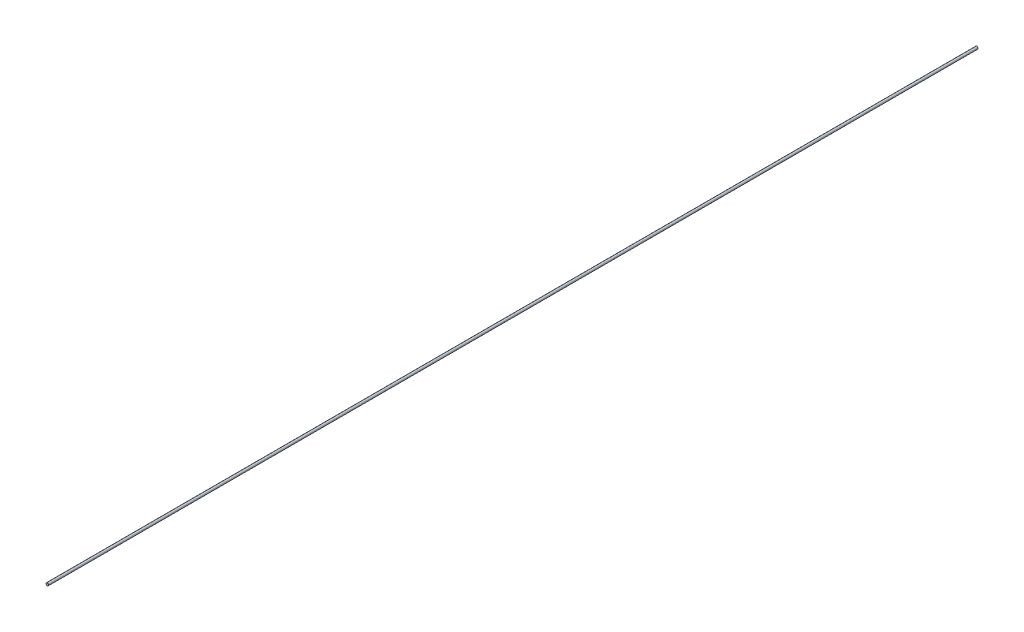
ISO-10303-21;
HEADER;
FILE_DESCRIPTION(('STEP AP214'),'2;1');
FILE_NAME('part.step','',(''),(''),'','','');
FILE_SCHEMA(('AUTOMOTIVE_DESIGN { 1 0 10303 214 1 1 1 1 }'));
ENDSEC;
DATA;
#1=APPLICATION_CONTEXT('core data for automotive mechanical design processes');
#2=APPLICATION_PROTOCOL_DEFINITION('international standard','automotive_design',2000,#1);
#3=PRODUCT_CONTEXT('',#1,'mechanical');
#4=PRODUCT('Part','Part','',(#3));
#5=PRODUCT_RELATED_PRODUCT_CATEGORY('part','',(#4));
#6=PRODUCT_DEFINITION_FORMATION('','',#4);
#7=PRODUCT_DEFINITION_CONTEXT('part definition',#1,'design');
#8=PRODUCT_DEFINITION('design','',#6,#7);
#9=PRODUCT_DEFINITION_SHAPE('','',#8);
#10=(LENGTH_UNIT() NAMED_UNIT(*) SI_UNIT(.MILLI.,.METRE.));
#11=(NAMED_UNIT(*) PLANE_ANGLE_UNIT() SI_UNIT($,.RADIAN.));
#12=(NAMED_UNIT(*) SI_UNIT($,.STERADIAN.) SOLID_ANGLE_UNIT());
#13=UNCERTAINTY_MEASURE_WITH_UNIT(LENGTH_MEASURE(1.E-05),#10,'distance_accuracy_value','');
#14=(GEOMETRIC_REPRESENTATION_CONTEXT(3) GLOBAL_UNCERTAINTY_ASSIGNED_CONTEXT((#13)) GLOBAL_UNIT_ASSIGNED_CONTEXT((#10,
#11,#12)) REPRESENTATION_CONTEXT('',''));
#15=CARTESIAN_POINT('',(0.,0.,0.));
#16=DIRECTION('',(0.,0.,1.));
#17=DIRECTION('',(1.,0.,0.));
#18=AXIS2_PLACEMENT_3D('',#15,#16,#17);
#19=CARTESIAN_POINT('',(0.,0.,914.4));
#20=DIRECTION('',(0.,0.,-1.));
#21=DIRECTION('',(-1.,0.,0.));
#22=AXIS2_PLACEMENT_3D('',#19,#20,#21);
#23=CYLINDRICAL_SURFACE('',#22,2.5);
#24=CARTESIAN_POINT('',(0.,0.,914.4));
#25=DIRECTION('',(0.,0.,1.));
#26=DIRECTION('',(1.,0.,0.));
#27=AXIS2_PLACEMENT_3D('',#24,#25,#26);
#28=CIRCLE('',#27,2.5);
#29=CARTESIAN_POINT('',(-2.5,0.,914.4));
#30=VERTEX_POINT('',#29);
#31=EDGE_CURVE('E10',#30,#30,#28,.T.);
#32=CARTESIAN_POINT('',(0.,0.,-914.4));
#33=DIRECTION('',(0.,0.,1.));
#34=DIRECTION('',(1.,0.,0.));
#35=AXIS2_PLACEMENT_3D('',#32,#33,#34);
#36=CIRCLE('',#35,2.5);
#37=CARTESIAN_POINT('',(-2.5,0.,-914.4));
#38=VERTEX_POINT('',#37);
#39=EDGE_CURVE('E38',#38,#38,#36,.T.);
#40=CARTESIAN_POINT('',(-2.5,0.,914.4));
#41=CARTESIAN_POINT('',(-2.5,0.,895.35));
#42=CARTESIAN_POINT('',(-2.5,0.,876.3));
#43=CARTESIAN_POINT('',(-2.5,0.,838.2));
#44=CARTESIAN_POINT('',(-2.5,0.,819.15));
#45=CARTESIAN_POINT('',(-2.5,0.,781.05));
#46=CARTESIAN_POINT('',(-2.5,0.,762.));
#47=CARTESIAN_POINT('',(-2.5,0.,723.9));
#48=CARTESIAN_POINT('',(-2.5,0.,704.85));
#49=CARTESIAN_POINT('',(-2.5,0.,666.75));
#50=CARTESIAN_POINT('',(-2.5,0.,647.7));
#51=CARTESIAN_POINT('',(-2.5,0.,609.6));
#52=CARTESIAN_POINT('',(-2.5,0.,590.55));
#53=CARTESIAN_POINT('',(-2.5,0.,552.45));
#54=CARTESIAN_POINT('',(-2.5,0.,533.4));
#55=CARTESIAN_POINT('',(-2.5,0.,495.3));
#56=CARTESIAN_POINT('',(-2.5,0.,476.25));
#57=CARTESIAN_POINT('',(-2.5,0.,438.15));
#58=CARTESIAN_POINT('',(-2.5,0.,419.1));
#59=CARTESIAN_POINT('',(-2.5,0.,381.));
#60=CARTESIAN_POINT('',(-2.5,0.,361.95));
#61=CARTESIAN_POINT('',(-2.5,0.,323.85));
#62=CARTESIAN_POINT('',(-2.5,0.,304.8));
#63=CARTESIAN_POINT('',(-2.5,0.,266.7));
#64=CARTESIAN_POINT('',(-2.5,0.,247.65));
#65=CARTESIAN_POINT('',(-2.5,0.,209.55));
#66=CARTESIAN_POINT('',(-2.5,0.,190.5));
#67=CARTESIAN_POINT('',(-2.5,0.,152.4));
#68=CARTESIAN_POINT('',(-2.5,0.,133.35));
#69=CARTESIAN_POINT('',(-2.5,0.,95.2499999999998));
#70=CARTESIAN_POINT('',(-2.5,0.,76.1999999999998));
#71=CARTESIAN_POINT('',(-2.5,0.,38.0999999999998));
#72=CARTESIAN_POINT('',(-2.5,0.,19.0499999999998));
#73=CARTESIAN_POINT('',(-2.5,0.,-19.0500000000002));
#74=CARTESIAN_POINT('',(-2.5,0.,-38.1000000000002));
#75=CARTESIAN_POINT('',(-2.5,0.,-76.2000000000002));
#76=CARTESIAN_POINT('',(-2.5,0.,-95.2500000000001));
#77=CARTESIAN_POINT('',(-2.5,0.,-133.35));
#78=CARTESIAN_POINT('',(-2.5,0.,-152.4));
#79=CARTESIAN_POINT('',(-2.5,0.,-190.5));
#80=CARTESIAN_POINT('',(-2.5,0.,-209.55));
#81=CARTESIAN_POINT('',(-2.5,0.,-247.65));
#82=CARTESIAN_POINT('',(-2.5,0.,-266.7));
#83=CARTESIAN_POINT('',(-2.5,0.,-304.8));
#84=CARTESIAN_POINT('',(-2.5,0.,-323.85));
#85=CARTESIAN_POINT('',(-2.5,0.,-361.95));
#86=CARTESIAN_POINT('',(-2.5,0.,-381.));
#87=CARTESIAN_POINT('',(-2.5,0.,-419.1));
#88=CARTESIAN_POINT('',(-2.5,0.,-438.15));
#89=CARTESIAN_POINT('',(-2.5,0.,-476.25));
#90=CARTESIAN_POINT('',(-2.5,0.,-495.3));
#91=CARTESIAN_POINT('',(-2.5,0.,-533.4));
#92=CARTESIAN_POINT('',(-2.5,0.,-552.45));
#93=CARTESIAN_POINT('',(-2.5,0.,-590.55));
#94=CARTESIAN_POINT('',(-2.5,0.,-609.6));
#95=CARTESIAN_POINT('',(-2.5,0.,-647.7));
#96=CARTESIAN_POINT('',(-2.5,0.,-666.75));
#97=CARTESIAN_POINT('',(-2.5,0.,-704.85));
#98=CARTESIAN_POINT('',(-2.5,0.,-723.9));
#99=CARTESIAN_POINT('',(-2.5,0.,-762.));
#100=CARTESIAN_POINT('',(-2.5,0.,-781.05));
#101=CARTESIAN_POINT('',(-2.5,0.,-819.15));
#102=CARTESIAN_POINT('',(-2.5,0.,-838.2));
#103=CARTESIAN_POINT('',(-2.5,0.,-876.3));
#104=CARTESIAN_POINT('',(-2.5,0.,-895.35));
#105=CARTESIAN_POINT('',(-2.5,0.,-914.4));
#106=B_SPLINE_CURVE_WITH_KNOTS('',3,(#40,#41,#42,#43,#44,#45,#46,#47,#48,#49,#50,#51,#52,#53,
#54,#55,#56,#57,#58,#59,#60,#61,#62,#63,#64,#65,#66,#67,#68,#69,#70,#71,#72,#73,#74,#75,#76,#77,
#78,#79,#80,#81,#82,#83,#84,#85,#86,#87,#88,#89,#90,#91,#92,#93,#94,#95,#96,#97,#98,#99,#100,
#101,#102,#103,#104,#105),.UNSPECIFIED.,.F.,.F.,(4,2,2,2,2,2,2,2,2,2,2,2,2,2,2,2,2,2,2,2,2,2,2,
2,2,2,2,2,2,2,2,2,4),(0.,57.1499999999999,114.3,171.45,228.6,285.75,342.9,400.05,457.2,514.35,
571.5,628.65,685.8,742.95,800.1,857.25,914.4,971.55,1028.7,1085.85,1143.,1200.15,1257.3,1314.45,
1371.6,1428.75,1485.9,1543.05,1600.2,1657.35,1714.5,1771.65,1828.8),.UNSPECIFIED.);
#107=EDGE_CURVE('BSEAM32',#30,#38,#106,.T.);
#108=ORIENTED_EDGE('',*,*,#31,.F.);
#109=ORIENTED_EDGE('',*,*,#39,.T.);
#110=ORIENTED_EDGE('',*,*,#107,.T.);
#111=ORIENTED_EDGE('',*,*,#107,.F.);
#112=EDGE_LOOP('',(#108,#110,#109,#111));
#113=FACE_BOUND('',#112,.T.);
#114=ADVANCED_FACE('F32',(#113),#23,.T.);
#115=CARTESIAN_POINT('',(0.,0.,914.4));
#116=DIRECTION('',(0.,0.,1.));
#117=DIRECTION('',(1.,0.,0.));
#118=AXIS2_PLACEMENT_3D('',#115,#116,#117);
#119=PLANE('',#118);
#120=ORIENTED_EDGE('',*,*,#31,.T.);
#121=EDGE_LOOP('',(#120));
#122=FACE_BOUND('',#121,.T.);
#123=ADVANCED_FACE('F47',(#122),#119,.T.);
#124=CARTESIAN_POINT('',(0.,0.,-914.4));
#125=DIRECTION('',(0.,0.,1.));
#126=DIRECTION('',(1.,0.,0.));
#127=AXIS2_PLACEMENT_3D('',#124,#125,#126);
#128=PLANE('',#127);
#129=ORIENTED_EDGE('',*,*,#39,.F.);
#130=EDGE_LOOP('',(#129));
#131=FACE_BOUND('',#130,.T.);
#132=ADVANCED_FACE('F45',(#131),#128,.F.);
#133=CLOSED_SHELL('',(#114,#123,#132));
#134=MANIFOLD_SOLID_BREP('B2',#133);
#135=ADVANCED_BREP_SHAPE_REPRESENTATION('',(#18,#134),#14);
#136=SHAPE_DEFINITION_REPRESENTATION(#9,#135);
ENDSEC;
END-ISO-10303-21;
